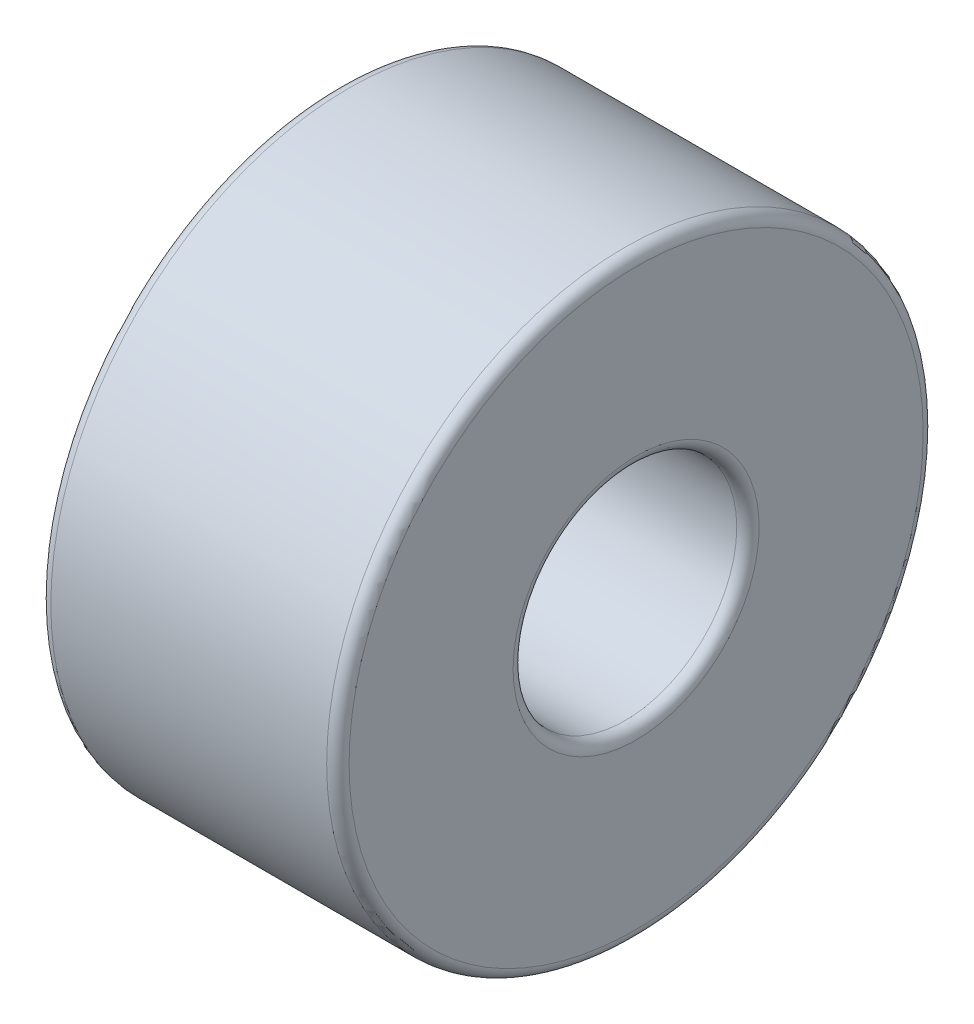
ISO-10303-21;
HEADER;
FILE_DESCRIPTION(('STEP AP214'),'2;1');
FILE_NAME('part.step','',(''),(''),'','','');
FILE_SCHEMA(('AUTOMOTIVE_DESIGN { 1 0 10303 214 1 1 1 1 }'));
ENDSEC;
DATA;
#1=APPLICATION_CONTEXT('core data for automotive mechanical design processes');
#2=APPLICATION_PROTOCOL_DEFINITION('international standard','automotive_design',2000,#1);
#3=PRODUCT_CONTEXT('',#1,'mechanical');
#4=PRODUCT('Part','Part','',(#3));
#5=PRODUCT_RELATED_PRODUCT_CATEGORY('part','',(#4));
#6=PRODUCT_DEFINITION_FORMATION('','',#4);
#7=PRODUCT_DEFINITION_CONTEXT('part definition',#1,'design');
#8=PRODUCT_DEFINITION('design','',#6,#7);
#9=PRODUCT_DEFINITION_SHAPE('','',#8);
#10=(LENGTH_UNIT() NAMED_UNIT(*) SI_UNIT(.MILLI.,.METRE.));
#11=(NAMED_UNIT(*) PLANE_ANGLE_UNIT() SI_UNIT($,.RADIAN.));
#12=(NAMED_UNIT(*) SI_UNIT($,.STERADIAN.) SOLID_ANGLE_UNIT());
#13=UNCERTAINTY_MEASURE_WITH_UNIT(LENGTH_MEASURE(1.E-05),#10,'distance_accuracy_value','');
#14=(GEOMETRIC_REPRESENTATION_CONTEXT(3) GLOBAL_UNCERTAINTY_ASSIGNED_CONTEXT((#13)) GLOBAL_UNIT_ASSIGNED_CONTEXT((#10,
#11,#12)) REPRESENTATION_CONTEXT('',''));
#15=CARTESIAN_POINT('',(0.,0.,0.));
#16=DIRECTION('',(0.,0.,1.));
#17=DIRECTION('',(1.,0.,0.));
#18=AXIS2_PLACEMENT_3D('',#15,#16,#17);
#19=CARTESIAN_POINT('',(3.85,0.,0.));
#20=DIRECTION('',(-1.,0.,0.));
#21=DIRECTION('',(0.,0.,1.));
#22=AXIS2_PLACEMENT_3D('',#19,#20,#21);
#23=TOROIDAL_SURFACE('',#22,1.65,0.15);
#24=CARTESIAN_POINT('',(3.85,0.,0.));
#25=DIRECTION('',(-1.,0.,0.));
#26=DIRECTION('',(0.,0.,1.));
#27=AXIS2_PLACEMENT_3D('',#24,#25,#26);
#28=CIRCLE('',#27,1.5);
#29=CARTESIAN_POINT('',(3.85,0.,1.5));
#30=VERTEX_POINT('',#29);
#31=EDGE_CURVE('E10',#30,#30,#28,.T.);
#32=ORIENTED_EDGE('',*,*,#31,.T.);
#33=EDGE_LOOP('',(#32));
#34=FACE_BOUND('',#33,.T.);
#35=CARTESIAN_POINT('',(4.,0.,0.));
#36=DIRECTION('',(-1.,0.,0.));
#37=DIRECTION('',(0.,0.,1.));
#38=AXIS2_PLACEMENT_3D('',#35,#36,#37);
#39=CIRCLE('',#38,1.65);
#40=CARTESIAN_POINT('',(4.,0.,1.65));
#41=VERTEX_POINT('',#40);
#42=EDGE_CURVE('E63',#41,#41,#39,.T.);
#43=ORIENTED_EDGE('',*,*,#42,.F.);
#44=EDGE_LOOP('',(#43));
#45=FACE_BOUND('',#44,.T.);
#46=ADVANCED_FACE('F34',(#34,#45),#23,.T.);
#47=CARTESIAN_POINT('',(4.,0.,0.));
#48=DIRECTION('',(-1.,0.,0.));
#49=DIRECTION('',(0.,0.,1.));
#50=AXIS2_PLACEMENT_3D('',#47,#48,#49);
#51=CYLINDRICAL_SURFACE('',#50,1.5);
#52=CARTESIAN_POINT('',(0.15,0.,0.));
#53=DIRECTION('',(-1.,0.,0.));
#54=DIRECTION('',(0.,0.,1.));
#55=AXIS2_PLACEMENT_3D('',#52,#53,#54);
#56=CIRCLE('',#55,1.5);
#57=CARTESIAN_POINT('',(0.15,0.,1.5));
#58=VERTEX_POINT('',#57);
#59=EDGE_CURVE('E41',#58,#58,#56,.T.);
#60=ORIENTED_EDGE('',*,*,#59,.T.);
#61=EDGE_LOOP('',(#60));
#62=FACE_BOUND('',#61,.T.);
#63=ORIENTED_EDGE('',*,*,#31,.F.);
#64=EDGE_LOOP('',(#63));
#65=FACE_BOUND('',#64,.T.);
#66=ADVANCED_FACE('F199',(#62,#65),#51,.F.);
#67=CARTESIAN_POINT('',(0.15,0.,0.));
#68=DIRECTION('',(-1.,0.,0.));
#69=DIRECTION('',(0.,0.,1.));
#70=AXIS2_PLACEMENT_3D('',#67,#68,#69);
#71=TOROIDAL_SURFACE('',#70,1.65,0.15);
#72=CARTESIAN_POINT('',(0.,0.,0.));
#73=DIRECTION('',(-1.,0.,0.));
#74=DIRECTION('',(0.,0.,1.));
#75=AXIS2_PLACEMENT_3D('',#72,#73,#74);
#76=CIRCLE('',#75,1.65);
#77=CARTESIAN_POINT('',(0.,0.,1.65));
#78=VERTEX_POINT('',#77);
#79=EDGE_CURVE('E45',#78,#78,#76,.T.);
#80=ORIENTED_EDGE('',*,*,#79,.T.);
#81=EDGE_LOOP('',(#80));
#82=FACE_BOUND('',#81,.T.);
#83=ORIENTED_EDGE('',*,*,#59,.F.);
#84=EDGE_LOOP('',(#83));
#85=FACE_BOUND('',#84,.T.);
#86=ADVANCED_FACE('F196',(#82,#85),#71,.T.);
#87=CARTESIAN_POINT('',(0.,1.65,0.));
#88=DIRECTION('',(-1.,0.,0.));
#89=DIRECTION('',(0.,0.,1.));
#90=AXIS2_PLACEMENT_3D('',#87,#88,#89);
#91=PLANE('',#90);
#92=CARTESIAN_POINT('',(0.,0.,0.));
#93=DIRECTION('',(-1.,0.,0.));
#94=DIRECTION('',(0.,0.,1.));
#95=AXIS2_PLACEMENT_3D('',#92,#93,#94);
#96=CIRCLE('',#95,3.85);
#97=CARTESIAN_POINT('',(0.,0.,3.85));
#98=VERTEX_POINT('',#97);
#99=EDGE_CURVE('E49',#98,#98,#96,.T.);
#100=ORIENTED_EDGE('',*,*,#99,.T.);
#101=EDGE_LOOP('',(#100));
#102=FACE_BOUND('',#101,.T.);
#103=ORIENTED_EDGE('',*,*,#79,.F.);
#104=EDGE_LOOP('',(#103));
#105=FACE_BOUND('',#104,.T.);
#106=ADVANCED_FACE('F192',(#102,#105),#91,.T.);
#107=CARTESIAN_POINT('',(0.15,0.,0.));
#108=DIRECTION('',(-1.,0.,0.));
#109=DIRECTION('',(0.,0.,1.));
#110=AXIS2_PLACEMENT_3D('',#107,#108,#109);
#111=TOROIDAL_SURFACE('',#110,3.85,0.15);
#112=CARTESIAN_POINT('',(0.15,0.,0.));
#113=DIRECTION('',(-1.,0.,0.));
#114=DIRECTION('',(0.,0.,1.));
#115=AXIS2_PLACEMENT_3D('',#112,#113,#114);
#116=CIRCLE('',#115,4.);
#117=CARTESIAN_POINT('',(0.15,0.,4.));
#118=VERTEX_POINT('',#117);
#119=EDGE_CURVE('E54',#118,#118,#116,.T.);
#120=ORIENTED_EDGE('',*,*,#119,.T.);
#121=EDGE_LOOP('',(#120));
#122=FACE_BOUND('',#121,.T.);
#123=ORIENTED_EDGE('',*,*,#99,.F.);
#124=EDGE_LOOP('',(#123));
#125=FACE_BOUND('',#124,.T.);
#126=ADVANCED_FACE('F188',(#122,#125),#111,.T.);
#127=CARTESIAN_POINT('',(4.,0.,0.));
#128=DIRECTION('',(-1.,0.,0.));
#129=DIRECTION('',(0.,0.,1.));
#130=AXIS2_PLACEMENT_3D('',#127,#128,#129);
#131=CYLINDRICAL_SURFACE('',#130,4.);
#132=CARTESIAN_POINT('',(3.85,0.,0.));
#133=DIRECTION('',(-1.,0.,0.));
#134=DIRECTION('',(0.,0.,1.));
#135=AXIS2_PLACEMENT_3D('',#132,#133,#134);
#136=CIRCLE('',#135,4.);
#137=CARTESIAN_POINT('',(3.85,0.,4.));
#138=VERTEX_POINT('',#137);
#139=EDGE_CURVE('E57',#138,#138,#136,.T.);
#140=ORIENTED_EDGE('',*,*,#139,.T.);
#141=EDGE_LOOP('',(#140));
#142=FACE_BOUND('',#141,.T.);
#143=ORIENTED_EDGE('',*,*,#119,.F.);
#144=EDGE_LOOP('',(#143));
#145=FACE_BOUND('',#144,.T.);
#146=ADVANCED_FACE('F184',(#142,#145),#131,.T.);
#147=CARTESIAN_POINT('',(3.85,0.,0.));
#148=DIRECTION('',(-1.,0.,0.));
#149=DIRECTION('',(0.,0.,1.));
#150=AXIS2_PLACEMENT_3D('',#147,#148,#149);
#151=TOROIDAL_SURFACE('',#150,3.85,0.15);
#152=CARTESIAN_POINT('',(4.,0.,0.));
#153=DIRECTION('',(-1.,0.,0.));
#154=DIRECTION('',(0.,0.,1.));
#155=AXIS2_PLACEMENT_3D('',#152,#153,#154);
#156=CIRCLE('',#155,3.85);
#157=CARTESIAN_POINT('',(4.,0.,3.85));
#158=VERTEX_POINT('',#157);
#159=EDGE_CURVE('E60',#158,#158,#156,.T.);
#160=ORIENTED_EDGE('',*,*,#159,.T.);
#161=EDGE_LOOP('',(#160));
#162=FACE_BOUND('',#161,.T.);
#163=ORIENTED_EDGE('',*,*,#139,.F.);
#164=EDGE_LOOP('',(#163));
#165=FACE_BOUND('',#164,.T.);
#166=ADVANCED_FACE('F180',(#162,#165),#151,.T.);
#167=CARTESIAN_POINT('',(4.,3.85,0.));
#168=DIRECTION('',(1.,0.,0.));
#169=DIRECTION('',(0.,0.,-1.));
#170=AXIS2_PLACEMENT_3D('',#167,#168,#169);
#171=PLANE('',#170);
#172=ORIENTED_EDGE('',*,*,#42,.T.);
#173=EDGE_LOOP('',(#172));
#174=FACE_BOUND('',#173,.T.);
#175=ORIENTED_EDGE('',*,*,#159,.F.);
#176=EDGE_LOOP('',(#175));
#177=FACE_BOUND('',#176,.T.);
#178=ADVANCED_FACE('F177',(#174,#177),#171,.T.);
#179=CLOSED_SHELL('',(#46,#66,#86,#106,#126,#146,#166,#178));
#180=CARTESIAN_POINT('',(4.,0.,0.));
#181=DIRECTION('',(-1.,0.,0.));
#182=DIRECTION('',(0.,0.,1.));
#183=AXIS2_PLACEMENT_3D('',#180,#181,#182);
#184=CYLINDRICAL_SURFACE('',#183,2.8175);
#185=CARTESIAN_POINT('',(1.9325,0.,0.));
#186=DIRECTION('',(-1.,0.,0.));
#187=DIRECTION('',(0.,0.,1.));
#188=AXIS2_PLACEMENT_3D('',#185,#186,#187);
#189=CIRCLE('',#188,2.8175);
#190=CARTESIAN_POINT('',(1.9325,0.,2.8175));
#191=VERTEX_POINT('',#190);
#192=EDGE_CURVE('E99',#191,#191,#189,.T.);
#193=ORIENTED_EDGE('',*,*,#192,.F.);
#194=EDGE_LOOP('',(#193));
#195=FACE_BOUND('',#194,.T.);
#196=CARTESIAN_POINT('',(0.75,0.,0.));
#197=DIRECTION('',(-1.,0.,0.));
#198=DIRECTION('',(0.,0.,1.));
#199=AXIS2_PLACEMENT_3D('',#196,#197,#198);
#200=CIRCLE('',#199,2.8175);
#201=CARTESIAN_POINT('',(0.75,0.,2.8175));
#202=VERTEX_POINT('',#201);
#203=EDGE_CURVE('E66',#202,#202,#200,.T.);
#204=ORIENTED_EDGE('',*,*,#203,.T.);
#205=EDGE_LOOP('',(#204));
#206=FACE_BOUND('',#205,.T.);
#207=ADVANCED_FACE('F105',(#195,#206),#184,.F.);
#208=CARTESIAN_POINT('',(0.75,2.8175,0.));
#209=DIRECTION('',(-1.,0.,0.));
#210=DIRECTION('',(0.,0.,1.));
#211=AXIS2_PLACEMENT_3D('',#208,#209,#210);
#212=PLANE('',#211);
#213=ORIENTED_EDGE('',*,*,#203,.F.);
#214=EDGE_LOOP('',(#213));
#215=FACE_BOUND('',#214,.T.);
#216=CARTESIAN_POINT('',(0.75,0.,0.));
#217=DIRECTION('',(-1.,0.,0.));
#218=DIRECTION('',(0.,0.,1.));
#219=AXIS2_PLACEMENT_3D('',#216,#217,#218);
#220=CIRCLE('',#219,2.6825);
#221=CARTESIAN_POINT('',(0.75,0.,2.6825));
#222=VERTEX_POINT('',#221);
#223=EDGE_CURVE('E69',#222,#222,#220,.T.);
#224=ORIENTED_EDGE('',*,*,#223,.T.);
#225=EDGE_LOOP('',(#224));
#226=FACE_BOUND('',#225,.T.);
#227=ADVANCED_FACE('F108',(#215,#226),#212,.F.);
#228=CARTESIAN_POINT('',(4.,0.,0.));
#229=DIRECTION('',(-1.,0.,0.));
#230=DIRECTION('',(0.,0.,1.));
#231=AXIS2_PLACEMENT_3D('',#228,#229,#230);
#232=CYLINDRICAL_SURFACE('',#231,2.6825);
#233=ORIENTED_EDGE('',*,*,#223,.F.);
#234=EDGE_LOOP('',(#233));
#235=FACE_BOUND('',#234,.T.);
#236=CARTESIAN_POINT('',(1.9325,0.,0.));
#237=DIRECTION('',(-1.,0.,0.));
#238=DIRECTION('',(0.,0.,1.));
#239=AXIS2_PLACEMENT_3D('',#236,#237,#238);
#240=CIRCLE('',#239,2.6825);
#241=CARTESIAN_POINT('',(1.9325,0.,2.6825));
#242=VERTEX_POINT('',#241);
#243=EDGE_CURVE('E72',#242,#242,#240,.T.);
#244=ORIENTED_EDGE('',*,*,#243,.T.);
#245=EDGE_LOOP('',(#244));
#246=FACE_BOUND('',#245,.T.);
#247=ADVANCED_FACE('F115',(#235,#246),#232,.T.);
#248=CARTESIAN_POINT('',(1.9325,2.6825,0.));
#249=DIRECTION('',(-1.,0.,0.));
#250=DIRECTION('',(0.,0.,1.));
#251=AXIS2_PLACEMENT_3D('',#248,#249,#250);
#252=PLANE('',#251);
#253=ORIENTED_EDGE('',*,*,#243,.F.);
#254=EDGE_LOOP('',(#253));
#255=FACE_BOUND('',#254,.T.);
#256=CARTESIAN_POINT('',(1.9325,0.,0.));
#257=DIRECTION('',(-1.,0.,0.));
#258=DIRECTION('',(0.,0.,1.));
#259=AXIS2_PLACEMENT_3D('',#256,#257,#258);
#260=CIRCLE('',#259,2.33333333333333);
#261=CARTESIAN_POINT('',(1.9325,0.,2.33333333333333));
#262=VERTEX_POINT('',#261);
#263=EDGE_CURVE('E75',#262,#262,#260,.T.);
#264=ORIENTED_EDGE('',*,*,#263,.T.);
#265=EDGE_LOOP('',(#264));
#266=FACE_BOUND('',#265,.T.);
#267=ADVANCED_FACE('F121',(#255,#266),#252,.F.);
#268=CARTESIAN_POINT('',(4.,0.,0.));
#269=DIRECTION('',(-1.,0.,0.));
#270=DIRECTION('',(0.,0.,1.));
#271=AXIS2_PLACEMENT_3D('',#268,#269,#270);
#272=CYLINDRICAL_SURFACE('',#271,2.33333333333333);
#273=ORIENTED_EDGE('',*,*,#263,.F.);
#274=EDGE_LOOP('',(#273));
#275=FACE_BOUND('',#274,.T.);
#276=CARTESIAN_POINT('',(2.0675,0.,0.));
#277=DIRECTION('',(-1.,0.,0.));
#278=DIRECTION('',(0.,0.,1.));
#279=AXIS2_PLACEMENT_3D('',#276,#277,#278);
#280=CIRCLE('',#279,2.33333333333333);
#281=CARTESIAN_POINT('',(2.0675,0.,2.33333333333333));
#282=VERTEX_POINT('',#281);
#283=EDGE_CURVE('E78',#282,#282,#280,.T.);
#284=ORIENTED_EDGE('',*,*,#283,.T.);
#285=EDGE_LOOP('',(#284));
#286=FACE_BOUND('',#285,.T.);
#287=ADVANCED_FACE('F127',(#275,#286),#272,.T.);
#288=CARTESIAN_POINT('',(2.0675,2.33333333333333,0.));
#289=DIRECTION('',(1.,0.,0.));
#290=DIRECTION('',(0.,0.,-1.));
#291=AXIS2_PLACEMENT_3D('',#288,#289,#290);
#292=PLANE('',#291);
#293=ORIENTED_EDGE('',*,*,#283,.F.);
#294=EDGE_LOOP('',(#293));
#295=FACE_BOUND('',#294,.T.);
#296=CARTESIAN_POINT('',(2.0675,0.,0.));
#297=DIRECTION('',(-1.,0.,0.));
#298=DIRECTION('',(0.,0.,1.));
#299=AXIS2_PLACEMENT_3D('',#296,#297,#298);
#300=CIRCLE('',#299,2.6825);
#301=CARTESIAN_POINT('',(2.0675,0.,2.6825));
#302=VERTEX_POINT('',#301);
#303=EDGE_CURVE('E81',#302,#302,#300,.T.);
#304=ORIENTED_EDGE('',*,*,#303,.T.);
#305=EDGE_LOOP('',(#304));
#306=FACE_BOUND('',#305,.T.);
#307=ADVANCED_FACE('F133',(#295,#306),#292,.F.);
#308=CARTESIAN_POINT('',(4.,0.,0.));
#309=DIRECTION('',(-1.,0.,0.));
#310=DIRECTION('',(0.,0.,1.));
#311=AXIS2_PLACEMENT_3D('',#308,#309,#310);
#312=CYLINDRICAL_SURFACE('',#311,2.6825);
#313=ORIENTED_EDGE('',*,*,#303,.F.);
#314=EDGE_LOOP('',(#313));
#315=FACE_BOUND('',#314,.T.);
#316=CARTESIAN_POINT('',(3.25,0.,0.));
#317=DIRECTION('',(-1.,0.,0.));
#318=DIRECTION('',(0.,0.,1.));
#319=AXIS2_PLACEMENT_3D('',#316,#317,#318);
#320=CIRCLE('',#319,2.6825);
#321=CARTESIAN_POINT('',(3.25,0.,2.6825));
#322=VERTEX_POINT('',#321);
#323=EDGE_CURVE('E84',#322,#322,#320,.T.);
#324=ORIENTED_EDGE('',*,*,#323,.T.);
#325=EDGE_LOOP('',(#324));
#326=FACE_BOUND('',#325,.T.);
#327=ADVANCED_FACE('F139',(#315,#326),#312,.T.);
#328=CARTESIAN_POINT('',(3.25,2.6825,0.));
#329=DIRECTION('',(1.,0.,0.));
#330=DIRECTION('',(0.,0.,-1.));
#331=AXIS2_PLACEMENT_3D('',#328,#329,#330);
#332=PLANE('',#331);
#333=ORIENTED_EDGE('',*,*,#323,.F.);
#334=EDGE_LOOP('',(#333));
#335=FACE_BOUND('',#334,.T.);
#336=CARTESIAN_POINT('',(3.25,0.,0.));
#337=DIRECTION('',(-1.,0.,0.));
#338=DIRECTION('',(0.,0.,1.));
#339=AXIS2_PLACEMENT_3D('',#336,#337,#338);
#340=CIRCLE('',#339,2.8175);
#341=CARTESIAN_POINT('',(3.25,0.,2.8175));
#342=VERTEX_POINT('',#341);
#343=EDGE_CURVE('E87',#342,#342,#340,.T.);
#344=ORIENTED_EDGE('',*,*,#343,.T.);
#345=EDGE_LOOP('',(#344));
#346=FACE_BOUND('',#345,.T.);
#347=ADVANCED_FACE('F145',(#335,#346),#332,.F.);
#348=CARTESIAN_POINT('',(4.,0.,0.));
#349=DIRECTION('',(-1.,0.,0.));
#350=DIRECTION('',(0.,0.,1.));
#351=AXIS2_PLACEMENT_3D('',#348,#349,#350);
#352=CYLINDRICAL_SURFACE('',#351,2.8175);
#353=ORIENTED_EDGE('',*,*,#343,.F.);
#354=EDGE_LOOP('',(#353));
#355=FACE_BOUND('',#354,.T.);
#356=CARTESIAN_POINT('',(2.0675,0.,0.));
#357=DIRECTION('',(-1.,0.,0.));
#358=DIRECTION('',(0.,0.,1.));
#359=AXIS2_PLACEMENT_3D('',#356,#357,#358);
#360=CIRCLE('',#359,2.8175);
#361=CARTESIAN_POINT('',(2.0675,0.,2.8175));
#362=VERTEX_POINT('',#361);
#363=EDGE_CURVE('E90',#362,#362,#360,.T.);
#364=ORIENTED_EDGE('',*,*,#363,.T.);
#365=EDGE_LOOP('',(#364));
#366=FACE_BOUND('',#365,.T.);
#367=ADVANCED_FACE('F151',(#355,#366),#352,.F.);
#368=CARTESIAN_POINT('',(2.0675,2.8175,0.));
#369=DIRECTION('',(1.,0.,0.));
#370=DIRECTION('',(0.,0.,-1.));
#371=AXIS2_PLACEMENT_3D('',#368,#369,#370);
#372=PLANE('',#371);
#373=ORIENTED_EDGE('',*,*,#363,.F.);
#374=EDGE_LOOP('',(#373));
#375=FACE_BOUND('',#374,.T.);
#376=CARTESIAN_POINT('',(2.0675,0.,0.));
#377=DIRECTION('',(-1.,0.,0.));
#378=DIRECTION('',(0.,0.,1.));
#379=AXIS2_PLACEMENT_3D('',#376,#377,#378);
#380=CIRCLE('',#379,3.16666666666666);
#381=CARTESIAN_POINT('',(2.0675,0.,3.16666666666666));
#382=VERTEX_POINT('',#381);
#383=EDGE_CURVE('E93',#382,#382,#380,.T.);
#384=ORIENTED_EDGE('',*,*,#383,.T.);
#385=EDGE_LOOP('',(#384));
#386=FACE_BOUND('',#385,.T.);
#387=ADVANCED_FACE('F157',(#375,#386),#372,.F.);
#388=CARTESIAN_POINT('',(4.,0.,0.));
#389=DIRECTION('',(-1.,0.,0.));
#390=DIRECTION('',(0.,0.,1.));
#391=AXIS2_PLACEMENT_3D('',#388,#389,#390);
#392=CYLINDRICAL_SURFACE('',#391,3.16666666666666);
#393=ORIENTED_EDGE('',*,*,#383,.F.);
#394=EDGE_LOOP('',(#393));
#395=FACE_BOUND('',#394,.T.);
#396=CARTESIAN_POINT('',(1.9325,0.,0.));
#397=DIRECTION('',(-1.,0.,0.));
#398=DIRECTION('',(0.,0.,1.));
#399=AXIS2_PLACEMENT_3D('',#396,#397,#398);
#400=CIRCLE('',#399,3.16666666666666);
#401=CARTESIAN_POINT('',(1.9325,0.,3.16666666666666));
#402=VERTEX_POINT('',#401);
#403=EDGE_CURVE('E96',#402,#402,#400,.T.);
#404=ORIENTED_EDGE('',*,*,#403,.T.);
#405=EDGE_LOOP('',(#404));
#406=FACE_BOUND('',#405,.T.);
#407=ADVANCED_FACE('F163',(#395,#406),#392,.F.);
#408=CARTESIAN_POINT('',(1.9325,3.16666666666666,0.));
#409=DIRECTION('',(-1.,0.,0.));
#410=DIRECTION('',(0.,0.,1.));
#411=AXIS2_PLACEMENT_3D('',#408,#409,#410);
#412=PLANE('',#411);
#413=ORIENTED_EDGE('',*,*,#403,.F.);
#414=EDGE_LOOP('',(#413));
#415=FACE_BOUND('',#414,.T.);
#416=ORIENTED_EDGE('',*,*,#192,.T.);
#417=EDGE_LOOP('',(#416));
#418=FACE_BOUND('',#417,.T.);
#419=ADVANCED_FACE('F103',(#415,#418),#412,.F.);
#420=CLOSED_SHELL('',(#207,#227,#247,#267,#287,#307,#327,#347,#367,#387,#407,#419));
#421=ORIENTED_CLOSED_SHELL('',*,#420,.T.);
#422=BREP_WITH_VOIDS('B2',#179,(#421));
#423=ADVANCED_BREP_SHAPE_REPRESENTATION('',(#18,#422),#14);
#424=SHAPE_DEFINITION_REPRESENTATION(#9,#423);
ENDSEC;
END-ISO-10303-21;
